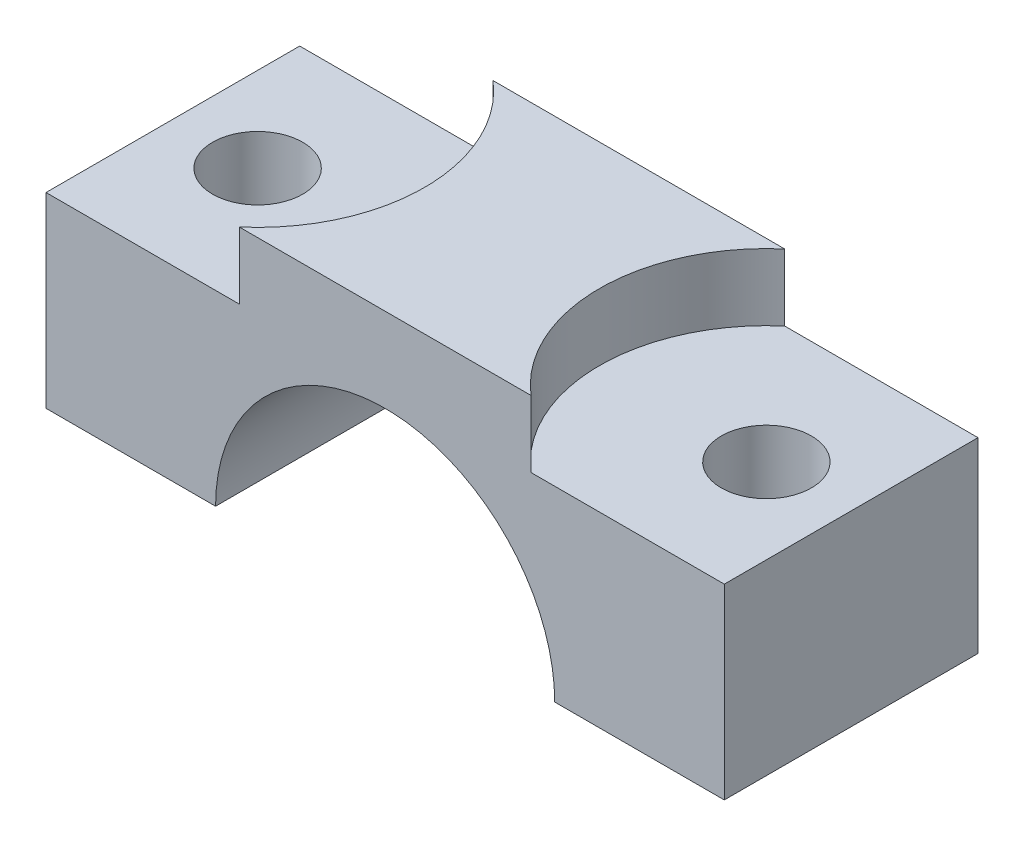
ISO-10303-21;
HEADER;
FILE_DESCRIPTION(('STEP AP214'),'2;1');
FILE_NAME('part.step','',(''),(''),'','','');
FILE_SCHEMA(('AUTOMOTIVE_DESIGN { 1 0 10303 214 1 1 1 1 }'));
ENDSEC;
DATA;
#1=APPLICATION_CONTEXT('core data for automotive mechanical design processes');
#2=APPLICATION_PROTOCOL_DEFINITION('international standard','automotive_design',2000,#1);
#3=PRODUCT_CONTEXT('',#1,'mechanical');
#4=PRODUCT('Part','Part','',(#3));
#5=PRODUCT_RELATED_PRODUCT_CATEGORY('part','',(#4));
#6=PRODUCT_DEFINITION_FORMATION('','',#4);
#7=PRODUCT_DEFINITION_CONTEXT('part definition',#1,'design');
#8=PRODUCT_DEFINITION('design','',#6,#7);
#9=PRODUCT_DEFINITION_SHAPE('','',#8);
#10=(LENGTH_UNIT() NAMED_UNIT(*) SI_UNIT(.MILLI.,.METRE.));
#11=(NAMED_UNIT(*) PLANE_ANGLE_UNIT() SI_UNIT($,.RADIAN.));
#12=(NAMED_UNIT(*) SI_UNIT($,.STERADIAN.) SOLID_ANGLE_UNIT());
#13=UNCERTAINTY_MEASURE_WITH_UNIT(LENGTH_MEASURE(1.E-05),#10,'distance_accuracy_value','');
#14=(GEOMETRIC_REPRESENTATION_CONTEXT(3) GLOBAL_UNCERTAINTY_ASSIGNED_CONTEXT((#13)) GLOBAL_UNIT_ASSIGNED_CONTEXT((#10,
#11,#12)) REPRESENTATION_CONTEXT('',''));
#15=CARTESIAN_POINT('',(0.,0.,0.));
#16=DIRECTION('',(0.,0.,1.));
#17=DIRECTION('',(1.,0.,0.));
#18=AXIS2_PLACEMENT_3D('',#15,#16,#17);
#19=CARTESIAN_POINT('',(25.4,19.,9.5));
#20=DIRECTION('',(-1.,0.,0.));
#21=DIRECTION('',(0.,-1.,0.));
#22=AXIS2_PLACEMENT_3D('',#19,#20,#21);
#23=PLANE('',#22);
#24=DIRECTION('',(0.,0.,-1.));
#25=VECTOR('',#24,1.);
#26=CARTESIAN_POINT('',(25.4,14.,9.5));
#27=LINE('',#26,#25);
#28=CARTESIAN_POINT('',(25.4,14.,9.5));
#29=VERTEX_POINT('',#28);
#30=CARTESIAN_POINT('',(25.4,14.,-9.5));
#31=VERTEX_POINT('',#30);
#32=EDGE_CURVE('E68',#29,#31,#27,.T.);
#33=ORIENTED_EDGE('',*,*,#32,.F.);
#34=DIRECTION('',(0.,1.,0.));
#35=VECTOR('',#34,1.);
#36=CARTESIAN_POINT('',(25.4,19.,9.5));
#37=LINE('',#36,#35);
#38=CARTESIAN_POINT('',(25.4,0.,9.5));
#39=VERTEX_POINT('',#38);
#40=EDGE_CURVE('E215',#39,#29,#37,.T.);
#41=ORIENTED_EDGE('',*,*,#40,.F.);
#42=DIRECTION('',(0.,0.,-1.));
#43=VECTOR('',#42,1.);
#44=CARTESIAN_POINT('',(25.4,0.,9.5));
#45=LINE('',#44,#43);
#46=CARTESIAN_POINT('',(25.4,0.,-9.5));
#47=VERTEX_POINT('',#46);
#48=EDGE_CURVE('E165',#39,#47,#45,.T.);
#49=ORIENTED_EDGE('',*,*,#48,.T.);
#50=DIRECTION('',(0.,1.,0.));
#51=VECTOR('',#50,1.);
#52=CARTESIAN_POINT('',(25.4,19.,-9.5));
#53=LINE('',#52,#51);
#54=EDGE_CURVE('E150',#47,#31,#53,.T.);
#55=ORIENTED_EDGE('',*,*,#54,.T.);
#56=EDGE_LOOP('',(#33,#41,#49,#55));
#57=FACE_BOUND('',#56,.T.);
#58=ADVANCED_FACE('F45',(#57),#23,.F.);
#59=CARTESIAN_POINT('',(-25.4,0.,9.5));
#60=DIRECTION('',(1.,0.,0.));
#61=DIRECTION('',(0.,0.,-1.));
#62=AXIS2_PLACEMENT_3D('',#59,#60,#61);
#63=PLANE('',#62);
#64=DIRECTION('',(0.,0.,1.));
#65=VECTOR('',#64,1.);
#66=CARTESIAN_POINT('',(-25.4,14.,9.5));
#67=LINE('',#66,#65);
#68=CARTESIAN_POINT('',(-25.4,14.,-9.5));
#69=VERTEX_POINT('',#68);
#70=CARTESIAN_POINT('',(-25.4,14.,9.5));
#71=VERTEX_POINT('',#70);
#72=EDGE_CURVE('E184',#69,#71,#67,.T.);
#73=ORIENTED_EDGE('',*,*,#72,.F.);
#74=DIRECTION('',(0.,-1.,0.));
#75=VECTOR('',#74,1.);
#76=CARTESIAN_POINT('',(-25.4,0.,-9.5));
#77=LINE('',#76,#75);
#78=CARTESIAN_POINT('',(-25.4,0.,-9.5));
#79=VERTEX_POINT('',#78);
#80=EDGE_CURVE('E149',#69,#79,#77,.T.);
#81=ORIENTED_EDGE('',*,*,#80,.T.);
#82=DIRECTION('',(0.,0.,-1.));
#83=VECTOR('',#82,1.);
#84=CARTESIAN_POINT('',(-25.4,0.,9.5));
#85=LINE('',#84,#83);
#86=CARTESIAN_POINT('',(-25.4,0.,9.5));
#87=VERTEX_POINT('',#86);
#88=EDGE_CURVE('E161',#87,#79,#85,.T.);
#89=ORIENTED_EDGE('',*,*,#88,.F.);
#90=DIRECTION('',(0.,-1.,0.));
#91=VECTOR('',#90,1.);
#92=CARTESIAN_POINT('',(-25.4,0.,9.5));
#93=LINE('',#92,#91);
#94=EDGE_CURVE('E166',#71,#87,#93,.T.);
#95=ORIENTED_EDGE('',*,*,#94,.F.);
#96=EDGE_LOOP('',(#73,#81,#89,#95));
#97=FACE_BOUND('',#96,.T.);
#98=ADVANCED_FACE('F188',(#97),#63,.F.);
#99=CARTESIAN_POINT('',(-25.4,0.,9.5));
#100=DIRECTION('',(0.,1.,0.));
#101=DIRECTION('',(-1.,0.,0.));
#102=AXIS2_PLACEMENT_3D('',#99,#100,#101);
#103=PLANE('',#102);
#104=CARTESIAN_POINT('',(-19.05,0.,0.));
#105=DIRECTION('',(0.,1.,0.));
#106=DIRECTION('',(0.,0.,1.));
#107=AXIS2_PLACEMENT_3D('',#104,#105,#106);
#108=CIRCLE('',#107,3.375);
#109=CARTESIAN_POINT('',(-19.05,0.,3.375));
#110=VERTEX_POINT('',#109);
#111=EDGE_CURVE('E241',#110,#110,#108,.T.);
#112=ORIENTED_EDGE('',*,*,#111,.T.);
#113=EDGE_LOOP('',(#112));
#114=FACE_BOUND('',#113,.T.);
#115=DIRECTION('',(1.,0.,0.));
#116=VECTOR('',#115,1.);
#117=CARTESIAN_POINT('',(-25.4,0.,-9.5));
#118=LINE('',#117,#116);
#119=CARTESIAN_POINT('',(-12.7,0.,-9.5));
#120=VERTEX_POINT('',#119);
#121=EDGE_CURVE('E205',#79,#120,#118,.T.);
#122=ORIENTED_EDGE('',*,*,#121,.T.);
#123=DIRECTION('',(0.,0.,-1.));
#124=VECTOR('',#123,1.);
#125=CARTESIAN_POINT('',(-12.7,0.,9.5));
#126=LINE('',#125,#124);
#127=CARTESIAN_POINT('',(-12.7,0.,9.5));
#128=VERTEX_POINT('',#127);
#129=EDGE_CURVE('E174',#128,#120,#126,.T.);
#130=ORIENTED_EDGE('',*,*,#129,.F.);
#131=DIRECTION('',(1.,0.,0.));
#132=VECTOR('',#131,1.);
#133=CARTESIAN_POINT('',(-25.4,0.,9.5));
#134=LINE('',#133,#132);
#135=EDGE_CURVE('E154',#87,#128,#134,.T.);
#136=ORIENTED_EDGE('',*,*,#135,.F.);
#137=ORIENTED_EDGE('',*,*,#88,.T.);
#138=EDGE_LOOP('',(#122,#130,#136,#137));
#139=FACE_BOUND('',#138,.T.);
#140=ADVANCED_FACE('F47',(#114,#139),#103,.F.);
#141=CARTESIAN_POINT('',(0.,0.,9.5));
#142=DIRECTION('',(0.,0.,-1.));
#143=DIRECTION('',(-1.,0.,0.));
#144=AXIS2_PLACEMENT_3D('',#141,#142,#143);
#145=CYLINDRICAL_SURFACE('',#144,12.7);
#146=CARTESIAN_POINT('',(0.,0.,-9.5));
#147=DIRECTION('',(0.,0.,-1.));
#148=DIRECTION('',(-1.,0.,0.));
#149=AXIS2_PLACEMENT_3D('',#146,#147,#148);
#150=CIRCLE('',#149,12.7);
#151=CARTESIAN_POINT('',(12.7,0.,-9.5));
#152=VERTEX_POINT('',#151);
#153=EDGE_CURVE('E226',#120,#152,#150,.T.);
#154=ORIENTED_EDGE('',*,*,#153,.T.);
#155=DIRECTION('',(0.,0.,-1.));
#156=VECTOR('',#155,1.);
#157=CARTESIAN_POINT('',(12.7,0.,9.5));
#158=LINE('',#157,#156);
#159=CARTESIAN_POINT('',(12.7,0.,9.5));
#160=VERTEX_POINT('',#159);
#161=EDGE_CURVE('E170',#160,#152,#158,.T.);
#162=ORIENTED_EDGE('',*,*,#161,.F.);
#163=CARTESIAN_POINT('',(0.,0.,9.5));
#164=DIRECTION('',(0.,0.,-1.));
#165=DIRECTION('',(-1.,0.,0.));
#166=AXIS2_PLACEMENT_3D('',#163,#164,#165);
#167=CIRCLE('',#166,12.7);
#168=EDGE_CURVE('E209',#128,#160,#167,.T.);
#169=ORIENTED_EDGE('',*,*,#168,.F.);
#170=ORIENTED_EDGE('',*,*,#129,.T.);
#171=EDGE_LOOP('',(#154,#162,#169,#170));
#172=FACE_BOUND('',#171,.T.);
#173=ADVANCED_FACE('F298',(#172),#145,.F.);
#174=CARTESIAN_POINT('',(12.7,0.,9.5));
#175=DIRECTION('',(0.,1.,0.));
#176=DIRECTION('',(-1.,0.,0.));
#177=AXIS2_PLACEMENT_3D('',#174,#175,#176);
#178=PLANE('',#177);
#179=CARTESIAN_POINT('',(19.05,0.,0.));
#180=DIRECTION('',(0.,1.,0.));
#181=DIRECTION('',(0.,0.,1.));
#182=AXIS2_PLACEMENT_3D('',#179,#180,#181);
#183=CIRCLE('',#182,3.375);
#184=CARTESIAN_POINT('',(19.05,0.,3.375));
#185=VERTEX_POINT('',#184);
#186=EDGE_CURVE('E253',#185,#185,#183,.T.);
#187=ORIENTED_EDGE('',*,*,#186,.T.);
#188=EDGE_LOOP('',(#187));
#189=FACE_BOUND('',#188,.T.);
#190=DIRECTION('',(1.,0.,0.));
#191=VECTOR('',#190,1.);
#192=CARTESIAN_POINT('',(12.7,0.,-9.5));
#193=LINE('',#192,#191);
#194=EDGE_CURVE('E157',#152,#47,#193,.T.);
#195=ORIENTED_EDGE('',*,*,#194,.T.);
#196=ORIENTED_EDGE('',*,*,#48,.F.);
#197=DIRECTION('',(1.,0.,0.));
#198=VECTOR('',#197,1.);
#199=CARTESIAN_POINT('',(12.7,0.,9.5));
#200=LINE('',#199,#198);
#201=EDGE_CURVE('E212',#160,#39,#200,.T.);
#202=ORIENTED_EDGE('',*,*,#201,.F.);
#203=ORIENTED_EDGE('',*,*,#161,.T.);
#204=EDGE_LOOP('',(#195,#196,#202,#203));
#205=FACE_BOUND('',#204,.T.);
#206=ADVANCED_FACE('F232',(#189,#205),#178,.F.);
#207=CARTESIAN_POINT('',(-25.4,19.,9.5));
#208=DIRECTION('',(0.,-1.,0.));
#209=DIRECTION('',(0.,0.,-1.));
#210=AXIS2_PLACEMENT_3D('',#207,#208,#209);
#211=PLANE('',#210);
#212=DIRECTION('',(-1.,0.,0.));
#213=VECTOR('',#212,1.);
#214=CARTESIAN_POINT('',(-25.4,19.,-9.5));
#215=LINE('',#214,#213);
#216=CARTESIAN_POINT('',(10.925961595364,19.,-9.5));
#217=VERTEX_POINT('',#216);
#218=CARTESIAN_POINT('',(-10.925961595364,19.,-9.5));
#219=VERTEX_POINT('',#218);
#220=EDGE_CURVE('E139',#217,#219,#215,.T.);
#221=ORIENTED_EDGE('',*,*,#220,.T.);
#222=CARTESIAN_POINT('',(-19.05,19.,0.));
#223=DIRECTION('',(0.,1.,0.));
#224=DIRECTION('',(0.,0.,1.));
#225=AXIS2_PLACEMENT_3D('',#222,#223,#224);
#226=CIRCLE('',#225,12.5);
#227=CARTESIAN_POINT('',(-10.925961595364,19.,9.5));
#228=VERTEX_POINT('',#227);
#229=EDGE_CURVE('E143',#228,#219,#226,.T.);
#230=ORIENTED_EDGE('',*,*,#229,.F.);
#231=DIRECTION('',(-1.,0.,0.));
#232=VECTOR('',#231,1.);
#233=CARTESIAN_POINT('',(-25.4,19.,9.5));
#234=LINE('',#233,#232);
#235=CARTESIAN_POINT('',(10.925961595364,19.,9.5));
#236=VERTEX_POINT('',#235);
#237=EDGE_CURVE('E141',#236,#228,#234,.T.);
#238=ORIENTED_EDGE('',*,*,#237,.F.);
#239=CARTESIAN_POINT('',(19.05,19.,0.));
#240=DIRECTION('',(0.,1.,0.));
#241=DIRECTION('',(0.,0.,1.));
#242=AXIS2_PLACEMENT_3D('',#239,#240,#241);
#243=CIRCLE('',#242,12.5);
#244=EDGE_CURVE('E125',#217,#236,#243,.T.);
#245=ORIENTED_EDGE('',*,*,#244,.F.);
#246=EDGE_LOOP('',(#221,#230,#238,#245));
#247=FACE_BOUND('',#246,.T.);
#248=ADVANCED_FACE('F137',(#247),#211,.F.);
#249=CARTESIAN_POINT('',(0.,0.,9.5));
#250=DIRECTION('',(0.,0.,-1.));
#251=DIRECTION('',(-1.,0.,0.));
#252=AXIS2_PLACEMENT_3D('',#249,#250,#251);
#253=PLANE('',#252);
#254=ORIENTED_EDGE('',*,*,#237,.T.);
#255=DIRECTION('',(0.,1.,0.));
#256=VECTOR('',#255,1.);
#257=CARTESIAN_POINT('',(-10.925961595364,14.,9.5));
#258=LINE('',#257,#256);
#259=CARTESIAN_POINT('',(-10.925961595364,14.,9.5));
#260=VERTEX_POINT('',#259);
#261=EDGE_CURVE('E196',#228,#260,#258,.F.);
#262=ORIENTED_EDGE('',*,*,#261,.T.);
#263=DIRECTION('',(1.,0.,0.));
#264=VECTOR('',#263,1.);
#265=CARTESIAN_POINT('',(0.,14.,9.5));
#266=LINE('',#265,#264);
#267=EDGE_CURVE('E191',#71,#260,#266,.T.);
#268=ORIENTED_EDGE('',*,*,#267,.F.);
#269=ORIENTED_EDGE('',*,*,#94,.T.);
#270=ORIENTED_EDGE('',*,*,#135,.T.);
#271=ORIENTED_EDGE('',*,*,#168,.T.);
#272=ORIENTED_EDGE('',*,*,#201,.T.);
#273=ORIENTED_EDGE('',*,*,#40,.T.);
#274=DIRECTION('',(1.,0.,0.));
#275=VECTOR('',#274,1.);
#276=CARTESIAN_POINT('',(0.,14.,9.5));
#277=LINE('',#276,#275);
#278=CARTESIAN_POINT('',(10.925961595364,14.,9.5));
#279=VERTEX_POINT('',#278);
#280=EDGE_CURVE('E198',#279,#29,#277,.T.);
#281=ORIENTED_EDGE('',*,*,#280,.F.);
#282=DIRECTION('',(0.,1.,0.));
#283=VECTOR('',#282,1.);
#284=CARTESIAN_POINT('',(10.925961595364,14.,9.5));
#285=LINE('',#284,#283);
#286=EDGE_CURVE('E192',#279,#236,#285,.T.);
#287=ORIENTED_EDGE('',*,*,#286,.T.);
#288=EDGE_LOOP('',(#254,#262,#268,#269,#270,#271,#272,#273,#281,#287));
#289=FACE_BOUND('',#288,.T.);
#290=ADVANCED_FACE('F244',(#289),#253,.F.);
#291=CARTESIAN_POINT('',(0.,0.,-9.5));
#292=DIRECTION('',(0.,0.,-1.));
#293=DIRECTION('',(-1.,0.,0.));
#294=AXIS2_PLACEMENT_3D('',#291,#292,#293);
#295=PLANE('',#294);
#296=DIRECTION('',(0.,1.,0.));
#297=VECTOR('',#296,1.);
#298=CARTESIAN_POINT('',(-10.925961595364,14.,-9.5));
#299=LINE('',#298,#297);
#300=CARTESIAN_POINT('',(-10.925961595364,14.,-9.5));
#301=VERTEX_POINT('',#300);
#302=EDGE_CURVE('E11',#219,#301,#299,.F.);
#303=ORIENTED_EDGE('',*,*,#302,.F.);
#304=ORIENTED_EDGE('',*,*,#220,.F.);
#305=DIRECTION('',(0.,1.,0.));
#306=VECTOR('',#305,1.);
#307=CARTESIAN_POINT('',(10.925961595364,14.,-9.5));
#308=LINE('',#307,#306);
#309=CARTESIAN_POINT('',(10.925961595364,14.,-9.5));
#310=VERTEX_POINT('',#309);
#311=EDGE_CURVE('E122',#310,#217,#308,.T.);
#312=ORIENTED_EDGE('',*,*,#311,.F.);
#313=DIRECTION('',(1.,0.,0.));
#314=VECTOR('',#313,1.);
#315=CARTESIAN_POINT('',(0.,14.,-9.5));
#316=LINE('',#315,#314);
#317=EDGE_CURVE('E132',#310,#31,#316,.T.);
#318=ORIENTED_EDGE('',*,*,#317,.T.);
#319=ORIENTED_EDGE('',*,*,#54,.F.);
#320=ORIENTED_EDGE('',*,*,#194,.F.);
#321=ORIENTED_EDGE('',*,*,#153,.F.);
#322=ORIENTED_EDGE('',*,*,#121,.F.);
#323=ORIENTED_EDGE('',*,*,#80,.F.);
#324=DIRECTION('',(1.,0.,0.));
#325=VECTOR('',#324,1.);
#326=CARTESIAN_POINT('',(0.,14.,-9.5));
#327=LINE('',#326,#325);
#328=EDGE_CURVE('E54',#69,#301,#327,.T.);
#329=ORIENTED_EDGE('',*,*,#328,.T.);
#330=EDGE_LOOP('',(#303,#304,#312,#318,#319,#320,#321,#322,#323,#329));
#331=FACE_BOUND('',#330,.T.);
#332=ADVANCED_FACE('F146',(#331),#295,.T.);
#333=CARTESIAN_POINT('',(19.05,14.,0.));
#334=DIRECTION('',(0.,1.,0.));
#335=DIRECTION('',(0.,0.,1.));
#336=AXIS2_PLACEMENT_3D('',#333,#334,#335);
#337=CYLINDRICAL_SURFACE('',#336,12.5);
#338=CARTESIAN_POINT('',(19.05,14.,0.));
#339=DIRECTION('',(0.,1.,0.));
#340=DIRECTION('',(0.,0.,1.));
#341=AXIS2_PLACEMENT_3D('',#338,#339,#340);
#342=CIRCLE('',#341,12.5);
#343=EDGE_CURVE('E128',#310,#279,#342,.T.);
#344=ORIENTED_EDGE('',*,*,#343,.F.);
#345=ORIENTED_EDGE('',*,*,#311,.T.);
#346=ORIENTED_EDGE('',*,*,#244,.T.);
#347=ORIENTED_EDGE('',*,*,#286,.F.);
#348=EDGE_LOOP('',(#344,#345,#346,#347));
#349=FACE_BOUND('',#348,.T.);
#350=ADVANCED_FACE('F124',(#349),#337,.F.);
#351=CARTESIAN_POINT('',(19.05,14.,0.));
#352=DIRECTION('',(0.,1.,0.));
#353=DIRECTION('',(0.,0.,1.));
#354=AXIS2_PLACEMENT_3D('',#351,#352,#353);
#355=PLANE('',#354);
#356=CARTESIAN_POINT('',(19.05,14.,0.));
#357=DIRECTION('',(0.,1.,0.));
#358=DIRECTION('',(0.,0.,1.));
#359=AXIS2_PLACEMENT_3D('',#356,#357,#358);
#360=CIRCLE('',#359,3.375);
#361=CARTESIAN_POINT('',(19.05,14.,3.375));
#362=VERTEX_POINT('',#361);
#363=EDGE_CURVE('E257',#362,#362,#360,.T.);
#364=ORIENTED_EDGE('',*,*,#363,.F.);
#365=EDGE_LOOP('',(#364));
#366=FACE_BOUND('',#365,.T.);
#367=ORIENTED_EDGE('',*,*,#280,.T.);
#368=ORIENTED_EDGE('',*,*,#32,.T.);
#369=ORIENTED_EDGE('',*,*,#317,.F.);
#370=ORIENTED_EDGE('',*,*,#343,.T.);
#371=EDGE_LOOP('',(#367,#368,#369,#370));
#372=FACE_BOUND('',#371,.T.);
#373=ADVANCED_FACE('F238',(#366,#372),#355,.T.);
#374=CARTESIAN_POINT('',(-19.05,14.,0.));
#375=DIRECTION('',(0.,1.,0.));
#376=DIRECTION('',(0.,0.,1.));
#377=AXIS2_PLACEMENT_3D('',#374,#375,#376);
#378=CYLINDRICAL_SURFACE('',#377,12.5);
#379=ORIENTED_EDGE('',*,*,#229,.T.);
#380=ORIENTED_EDGE('',*,*,#302,.T.);
#381=CARTESIAN_POINT('',(-19.05,14.,0.));
#382=DIRECTION('',(0.,1.,0.));
#383=DIRECTION('',(0.,0.,1.));
#384=AXIS2_PLACEMENT_3D('',#381,#382,#383);
#385=CIRCLE('',#384,12.5);
#386=EDGE_CURVE('E61',#260,#301,#385,.T.);
#387=ORIENTED_EDGE('',*,*,#386,.F.);
#388=ORIENTED_EDGE('',*,*,#261,.F.);
#389=EDGE_LOOP('',(#379,#380,#387,#388));
#390=FACE_BOUND('',#389,.T.);
#391=ADVANCED_FACE('F279',(#390),#378,.F.);
#392=CARTESIAN_POINT('',(-19.05,14.,0.));
#393=DIRECTION('',(0.,1.,0.));
#394=DIRECTION('',(0.,0.,1.));
#395=AXIS2_PLACEMENT_3D('',#392,#393,#394);
#396=PLANE('',#395);
#397=CARTESIAN_POINT('',(-19.05,14.,0.));
#398=DIRECTION('',(0.,1.,0.));
#399=DIRECTION('',(0.,0.,1.));
#400=AXIS2_PLACEMENT_3D('',#397,#398,#399);
#401=CIRCLE('',#400,3.375);
#402=CARTESIAN_POINT('',(-19.05,14.,3.375));
#403=VERTEX_POINT('',#402);
#404=EDGE_CURVE('E261',#403,#403,#401,.T.);
#405=ORIENTED_EDGE('',*,*,#404,.F.);
#406=EDGE_LOOP('',(#405));
#407=FACE_BOUND('',#406,.T.);
#408=ORIENTED_EDGE('',*,*,#267,.T.);
#409=ORIENTED_EDGE('',*,*,#386,.T.);
#410=ORIENTED_EDGE('',*,*,#328,.F.);
#411=ORIENTED_EDGE('',*,*,#72,.T.);
#412=EDGE_LOOP('',(#408,#409,#410,#411));
#413=FACE_BOUND('',#412,.T.);
#414=ADVANCED_FACE('F183',(#407,#413),#396,.T.);
#415=CARTESIAN_POINT('',(-19.05,0.,0.));
#416=DIRECTION('',(0.,1.,0.));
#417=DIRECTION('',(0.,0.,1.));
#418=AXIS2_PLACEMENT_3D('',#415,#416,#417);
#419=CYLINDRICAL_SURFACE('',#418,3.375);
#420=CARTESIAN_POINT('',(-19.05,0.,3.375));
#421=CARTESIAN_POINT('',(-19.05,0.145833333333333,3.375));
#422=CARTESIAN_POINT('',(-19.05,0.291666666666667,3.375));
#423=CARTESIAN_POINT('',(-19.05,0.583333333333333,3.375));
#424=CARTESIAN_POINT('',(-19.05,0.729166666666667,3.375));
#425=CARTESIAN_POINT('',(-19.05,1.02083333333333,3.375));
#426=CARTESIAN_POINT('',(-19.05,1.16666666666667,3.375));
#427=CARTESIAN_POINT('',(-19.05,1.45833333333333,3.375));
#428=CARTESIAN_POINT('',(-19.05,1.60416666666667,3.375));
#429=CARTESIAN_POINT('',(-19.05,1.89583333333333,3.375));
#430=CARTESIAN_POINT('',(-19.05,2.04166666666667,3.375));
#431=CARTESIAN_POINT('',(-19.05,2.33333333333333,3.375));
#432=CARTESIAN_POINT('',(-19.05,2.47916666666667,3.375));
#433=CARTESIAN_POINT('',(-19.05,2.77083333333333,3.375));
#434=CARTESIAN_POINT('',(-19.05,2.91666666666667,3.375));
#435=CARTESIAN_POINT('',(-19.05,3.20833333333333,3.375));
#436=CARTESIAN_POINT('',(-19.05,3.35416666666667,3.375));
#437=CARTESIAN_POINT('',(-19.05,3.64583333333333,3.375));
#438=CARTESIAN_POINT('',(-19.05,3.79166666666667,3.375));
#439=CARTESIAN_POINT('',(-19.05,4.08333333333333,3.375));
#440=CARTESIAN_POINT('',(-19.05,4.22916666666667,3.375));
#441=CARTESIAN_POINT('',(-19.05,4.52083333333333,3.375));
#442=CARTESIAN_POINT('',(-19.05,4.66666666666667,3.375));
#443=CARTESIAN_POINT('',(-19.05,4.95833333333333,3.375));
#444=CARTESIAN_POINT('',(-19.05,5.10416666666667,3.375));
#445=CARTESIAN_POINT('',(-19.05,5.39583333333333,3.375));
#446=CARTESIAN_POINT('',(-19.05,5.54166666666667,3.375));
#447=CARTESIAN_POINT('',(-19.05,5.83333333333333,3.375));
#448=CARTESIAN_POINT('',(-19.05,5.97916666666667,3.375));
#449=CARTESIAN_POINT('',(-19.05,6.27083333333333,3.375));
#450=CARTESIAN_POINT('',(-19.05,6.41666666666667,3.375));
#451=CARTESIAN_POINT('',(-19.05,6.70833333333333,3.375));
#452=CARTESIAN_POINT('',(-19.05,6.85416666666666,3.375));
#453=CARTESIAN_POINT('',(-19.05,7.14583333333333,3.375));
#454=CARTESIAN_POINT('',(-19.05,7.29166666666667,3.375));
#455=CARTESIAN_POINT('',(-19.05,7.58333333333333,3.375));
#456=CARTESIAN_POINT('',(-19.05,7.72916666666667,3.375));
#457=CARTESIAN_POINT('',(-19.05,8.02083333333333,3.375));
#458=CARTESIAN_POINT('',(-19.05,8.16666666666666,3.375));
#459=CARTESIAN_POINT('',(-19.05,8.45833333333333,3.375));
#460=CARTESIAN_POINT('',(-19.05,8.60416666666666,3.375));
#461=CARTESIAN_POINT('',(-19.05,8.89583333333333,3.375));
#462=CARTESIAN_POINT('',(-19.05,9.04166666666666,3.375));
#463=CARTESIAN_POINT('',(-19.05,9.33333333333333,3.375));
#464=CARTESIAN_POINT('',(-19.05,9.47916666666666,3.375));
#465=CARTESIAN_POINT('',(-19.05,9.77083333333333,3.375));
#466=CARTESIAN_POINT('',(-19.05,9.91666666666666,3.375));
#467=CARTESIAN_POINT('',(-19.05,10.2083333333333,3.375));
#468=CARTESIAN_POINT('',(-19.05,10.3541666666667,3.375));
#469=CARTESIAN_POINT('',(-19.05,10.6458333333333,3.375));
#470=CARTESIAN_POINT('',(-19.05,10.7916666666667,3.375));
#471=CARTESIAN_POINT('',(-19.05,11.0833333333333,3.375));
#472=CARTESIAN_POINT('',(-19.05,11.2291666666667,3.375));
#473=CARTESIAN_POINT('',(-19.05,11.5208333333333,3.375));
#474=CARTESIAN_POINT('',(-19.05,11.6666666666667,3.375));
#475=CARTESIAN_POINT('',(-19.05,11.9583333333333,3.375));
#476=CARTESIAN_POINT('',(-19.05,12.1041666666667,3.375));
#477=CARTESIAN_POINT('',(-19.05,12.3958333333333,3.375));
#478=CARTESIAN_POINT('',(-19.05,12.5416666666667,3.375));
#479=CARTESIAN_POINT('',(-19.05,12.8333333333333,3.375));
#480=CARTESIAN_POINT('',(-19.05,12.9791666666667,3.375));
#481=CARTESIAN_POINT('',(-19.05,13.2708333333333,3.375));
#482=CARTESIAN_POINT('',(-19.05,13.4166666666667,3.375));
#483=CARTESIAN_POINT('',(-19.05,13.7083333333333,3.375));
#484=CARTESIAN_POINT('',(-19.05,13.8541666666667,3.375));
#485=CARTESIAN_POINT('',(-19.05,14.,3.375));
#486=B_SPLINE_CURVE_WITH_KNOTS('',3,(#420,#421,#422,#423,#424,#425,#426,#427,#428,#429,#430,
#431,#432,#433,#434,#435,#436,#437,#438,#439,#440,#441,#442,#443,#444,#445,#446,#447,#448,#449,
#450,#451,#452,#453,#454,#455,#456,#457,#458,#459,#460,#461,#462,#463,#464,#465,#466,#467,#468,
#469,#470,#471,#472,#473,#474,#475,#476,#477,#478,#479,#480,#481,#482,#483,#484,#485),
.UNSPECIFIED.,.F.,.F.,(4,2,2,2,2,2,2,2,2,2,2,2,2,2,2,2,2,2,2,2,2,2,2,2,2,2,2,2,2,2,2,2,4),(0.,
0.4375,0.875,1.3125,1.75,2.1875,2.625,3.0625,3.5,3.9375,4.375,4.8125,5.25,5.6875,6.125,6.5625,
7.,7.4375,7.875,8.3125,8.75,9.1875,9.625,10.0625,10.5,10.9375,11.375,11.8125,12.25,12.6875,
13.125,13.5625,14.),.UNSPECIFIED.);
#487=EDGE_CURVE('BSEAM271',#110,#403,#486,.T.);
#488=ORIENTED_EDGE('',*,*,#111,.F.);
#489=ORIENTED_EDGE('',*,*,#404,.T.);
#490=ORIENTED_EDGE('',*,*,#487,.T.);
#491=ORIENTED_EDGE('',*,*,#487,.F.);
#492=EDGE_LOOP('',(#488,#490,#489,#491));
#493=FACE_BOUND('',#492,.T.);
#494=ADVANCED_FACE('F271',(#493),#419,.F.);
#495=CARTESIAN_POINT('',(19.05,0.,0.));
#496=DIRECTION('',(0.,1.,0.));
#497=DIRECTION('',(0.,0.,1.));
#498=AXIS2_PLACEMENT_3D('',#495,#496,#497);
#499=CYLINDRICAL_SURFACE('',#498,3.375);
#500=CARTESIAN_POINT('',(19.05,0.,3.375));
#501=CARTESIAN_POINT('',(19.05,0.145833333333333,3.375));
#502=CARTESIAN_POINT('',(19.05,0.291666666666667,3.375));
#503=CARTESIAN_POINT('',(19.05,0.583333333333333,3.375));
#504=CARTESIAN_POINT('',(19.05,0.729166666666667,3.375));
#505=CARTESIAN_POINT('',(19.05,1.02083333333333,3.375));
#506=CARTESIAN_POINT('',(19.05,1.16666666666667,3.375));
#507=CARTESIAN_POINT('',(19.05,1.45833333333333,3.375));
#508=CARTESIAN_POINT('',(19.05,1.60416666666667,3.375));
#509=CARTESIAN_POINT('',(19.05,1.89583333333333,3.375));
#510=CARTESIAN_POINT('',(19.05,2.04166666666667,3.375));
#511=CARTESIAN_POINT('',(19.05,2.33333333333333,3.375));
#512=CARTESIAN_POINT('',(19.05,2.47916666666667,3.375));
#513=CARTESIAN_POINT('',(19.05,2.77083333333333,3.375));
#514=CARTESIAN_POINT('',(19.05,2.91666666666667,3.375));
#515=CARTESIAN_POINT('',(19.05,3.20833333333333,3.375));
#516=CARTESIAN_POINT('',(19.05,3.35416666666667,3.375));
#517=CARTESIAN_POINT('',(19.05,3.64583333333333,3.375));
#518=CARTESIAN_POINT('',(19.05,3.79166666666667,3.375));
#519=CARTESIAN_POINT('',(19.05,4.08333333333333,3.375));
#520=CARTESIAN_POINT('',(19.05,4.22916666666667,3.375));
#521=CARTESIAN_POINT('',(19.05,4.52083333333333,3.375));
#522=CARTESIAN_POINT('',(19.05,4.66666666666667,3.375));
#523=CARTESIAN_POINT('',(19.05,4.95833333333333,3.375));
#524=CARTESIAN_POINT('',(19.05,5.10416666666667,3.375));
#525=CARTESIAN_POINT('',(19.05,5.39583333333333,3.375));
#526=CARTESIAN_POINT('',(19.05,5.54166666666667,3.375));
#527=CARTESIAN_POINT('',(19.05,5.83333333333333,3.375));
#528=CARTESIAN_POINT('',(19.05,5.97916666666667,3.375));
#529=CARTESIAN_POINT('',(19.05,6.27083333333333,3.375));
#530=CARTESIAN_POINT('',(19.05,6.41666666666667,3.375));
#531=CARTESIAN_POINT('',(19.05,6.70833333333333,3.375));
#532=CARTESIAN_POINT('',(19.05,6.85416666666666,3.375));
#533=CARTESIAN_POINT('',(19.05,7.14583333333333,3.375));
#534=CARTESIAN_POINT('',(19.05,7.29166666666667,3.375));
#535=CARTESIAN_POINT('',(19.05,7.58333333333333,3.375));
#536=CARTESIAN_POINT('',(19.05,7.72916666666667,3.375));
#537=CARTESIAN_POINT('',(19.05,8.02083333333333,3.375));
#538=CARTESIAN_POINT('',(19.05,8.16666666666666,3.375));
#539=CARTESIAN_POINT('',(19.05,8.45833333333333,3.375));
#540=CARTESIAN_POINT('',(19.05,8.60416666666666,3.375));
#541=CARTESIAN_POINT('',(19.05,8.89583333333333,3.375));
#542=CARTESIAN_POINT('',(19.05,9.04166666666666,3.375));
#543=CARTESIAN_POINT('',(19.05,9.33333333333333,3.375));
#544=CARTESIAN_POINT('',(19.05,9.47916666666666,3.375));
#545=CARTESIAN_POINT('',(19.05,9.77083333333333,3.375));
#546=CARTESIAN_POINT('',(19.05,9.91666666666666,3.375));
#547=CARTESIAN_POINT('',(19.05,10.2083333333333,3.375));
#548=CARTESIAN_POINT('',(19.05,10.3541666666667,3.375));
#549=CARTESIAN_POINT('',(19.05,10.6458333333333,3.375));
#550=CARTESIAN_POINT('',(19.05,10.7916666666667,3.375));
#551=CARTESIAN_POINT('',(19.05,11.0833333333333,3.375));
#552=CARTESIAN_POINT('',(19.05,11.2291666666667,3.375));
#553=CARTESIAN_POINT('',(19.05,11.5208333333333,3.375));
#554=CARTESIAN_POINT('',(19.05,11.6666666666667,3.375));
#555=CARTESIAN_POINT('',(19.05,11.9583333333333,3.375));
#556=CARTESIAN_POINT('',(19.05,12.1041666666667,3.375));
#557=CARTESIAN_POINT('',(19.05,12.3958333333333,3.375));
#558=CARTESIAN_POINT('',(19.05,12.5416666666667,3.375));
#559=CARTESIAN_POINT('',(19.05,12.8333333333333,3.375));
#560=CARTESIAN_POINT('',(19.05,12.9791666666667,3.375));
#561=CARTESIAN_POINT('',(19.05,13.2708333333333,3.375));
#562=CARTESIAN_POINT('',(19.05,13.4166666666667,3.375));
#563=CARTESIAN_POINT('',(19.05,13.7083333333333,3.375));
#564=CARTESIAN_POINT('',(19.05,13.8541666666667,3.375));
#565=CARTESIAN_POINT('',(19.05,14.,3.375));
#566=B_SPLINE_CURVE_WITH_KNOTS('',3,(#500,#501,#502,#503,#504,#505,#506,#507,#508,#509,#510,
#511,#512,#513,#514,#515,#516,#517,#518,#519,#520,#521,#522,#523,#524,#525,#526,#527,#528,#529,
#530,#531,#532,#533,#534,#535,#536,#537,#538,#539,#540,#541,#542,#543,#544,#545,#546,#547,#548,
#549,#550,#551,#552,#553,#554,#555,#556,#557,#558,#559,#560,#561,#562,#563,#564,#565),
.UNSPECIFIED.,.F.,.F.,(4,2,2,2,2,2,2,2,2,2,2,2,2,2,2,2,2,2,2,2,2,2,2,2,2,2,2,2,2,2,2,2,4),(0.,
0.4375,0.875,1.3125,1.75,2.1875,2.625,3.0625,3.5,3.9375,4.375,4.8125,5.25,5.6875,6.125,6.5625,
7.,7.4375,7.875,8.3125,8.75,9.1875,9.625,10.0625,10.5,10.9375,11.375,11.8125,12.25,12.6875,
13.125,13.5625,14.),.UNSPECIFIED.);
#567=EDGE_CURVE('BSEAM274',#185,#362,#566,.T.);
#568=ORIENTED_EDGE('',*,*,#186,.F.);
#569=ORIENTED_EDGE('',*,*,#363,.T.);
#570=ORIENTED_EDGE('',*,*,#567,.T.);
#571=ORIENTED_EDGE('',*,*,#567,.F.);
#572=EDGE_LOOP('',(#568,#570,#569,#571));
#573=FACE_BOUND('',#572,.T.);
#574=ADVANCED_FACE('F274',(#573),#499,.F.);
#575=CLOSED_SHELL('',(#58,#98,#140,#173,#206,#248,#290,#332,#350,#373,#391,#414,#494,#574));
#576=MANIFOLD_SOLID_BREP('B2',#575);
#577=ADVANCED_BREP_SHAPE_REPRESENTATION('',(#18,#576),#14);
#578=SHAPE_DEFINITION_REPRESENTATION(#9,#577);
ENDSEC;
END-ISO-10303-21;
